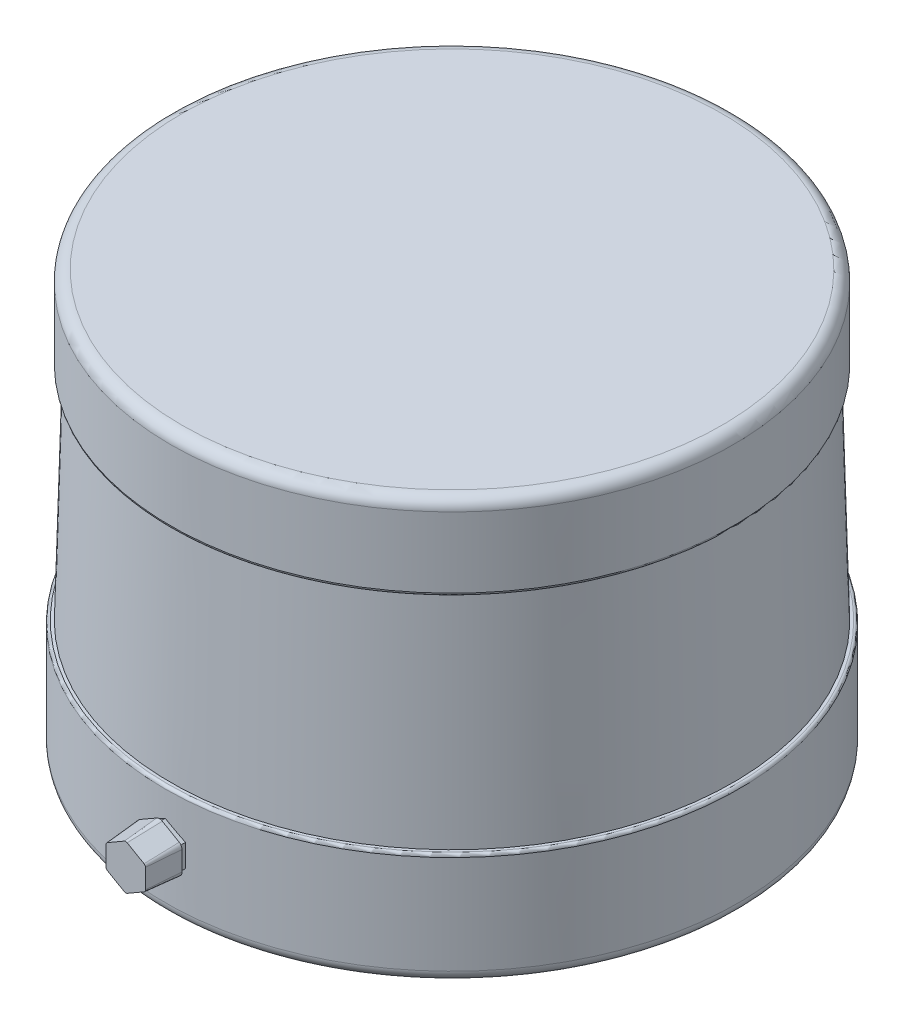
ISO-10303-21;
HEADER;
FILE_DESCRIPTION(('STEP AP214'),'2;1');
FILE_NAME('part.step','',(''),(''),'','','');
FILE_SCHEMA(('AUTOMOTIVE_DESIGN { 1 0 10303 214 1 1 1 1 }'));
ENDSEC;
DATA;
#1=APPLICATION_CONTEXT('core data for automotive mechanical design processes');
#2=APPLICATION_PROTOCOL_DEFINITION('international standard','automotive_design',2000,#1);
#3=PRODUCT_CONTEXT('',#1,'mechanical');
#4=PRODUCT('Part','Part','',(#3));
#5=PRODUCT_RELATED_PRODUCT_CATEGORY('part','',(#4));
#6=PRODUCT_DEFINITION_FORMATION('','',#4);
#7=PRODUCT_DEFINITION_CONTEXT('part definition',#1,'design');
#8=PRODUCT_DEFINITION('design','',#6,#7);
#9=PRODUCT_DEFINITION_SHAPE('','',#8);
#10=(LENGTH_UNIT() NAMED_UNIT(*) SI_UNIT(.MILLI.,.METRE.));
#11=(NAMED_UNIT(*) PLANE_ANGLE_UNIT() SI_UNIT($,.RADIAN.));
#12=(NAMED_UNIT(*) SI_UNIT($,.STERADIAN.) SOLID_ANGLE_UNIT());
#13=UNCERTAINTY_MEASURE_WITH_UNIT(LENGTH_MEASURE(1.E-05),#10,'distance_accuracy_value','');
#14=(GEOMETRIC_REPRESENTATION_CONTEXT(3) GLOBAL_UNCERTAINTY_ASSIGNED_CONTEXT((#13)) GLOBAL_UNIT_ASSIGNED_CONTEXT((#10,
#11,#12)) REPRESENTATION_CONTEXT('',''));
#15=CARTESIAN_POINT('',(0.,0.,0.));
#16=DIRECTION('',(0.,0.,1.));
#17=DIRECTION('',(1.,0.,0.));
#18=AXIS2_PLACEMENT_3D('',#15,#16,#17);
#19=CARTESIAN_POINT('',(0.,0.,0.));
#20=DIRECTION('',(0.,-1.,0.));
#21=DIRECTION('',(0.,0.,-1.));
#22=AXIS2_PLACEMENT_3D('',#19,#20,#21);
#23=CYLINDRICAL_SURFACE('',#22,51.);
#24=CARTESIAN_POINT('',(0.,19.5,0.));
#25=DIRECTION('',(0.,1.,0.));
#26=DIRECTION('',(0.,0.,1.));
#27=AXIS2_PLACEMENT_3D('',#24,#25,#26);
#28=CIRCLE('',#27,51.);
#29=CARTESIAN_POINT('',(0.,19.5,51.));
#30=VERTEX_POINT('',#29);
#31=EDGE_CURVE('E225',#30,#30,#28,.F.);
#32=ORIENTED_EDGE('',*,*,#31,.T.);
#33=EDGE_LOOP('',(#32));
#34=FACE_BOUND('',#33,.T.);
#35=CARTESIAN_POINT('',(0.,2.,0.));
#36=DIRECTION('',(0.,-1.,0.));
#37=DIRECTION('',(0.,0.,-1.));
#38=AXIS2_PLACEMENT_3D('',#35,#36,#37);
#39=CIRCLE('',#38,51.);
#40=CARTESIAN_POINT('',(0.,2.,-51.));
#41=VERTEX_POINT('',#40);
#42=EDGE_CURVE('E216',#41,#41,#39,.F.);
#43=ORIENTED_EDGE('',*,*,#42,.T.);
#44=EDGE_LOOP('',(#43));
#45=FACE_BOUND('',#44,.T.);
#46=CARTESIAN_POINT('',(0.,6.91709623134524,0.));
#47=DIRECTION('',(-0.5,0.866025403784439,0.));
#48=DIRECTION('',(-0.866025403784439,-0.5,0.));
#49=AXIS2_PLACEMENT_3D('',#46,#47,#48);
#50=ELLIPSE('',#49,58.8897274573418,51.);
#51=CARTESIAN_POINT('',(3.5,8.93782217350893,50.8797602195608));
#52=VERTEX_POINT('',#51);
#53=CARTESIAN_POINT('',(0.,6.91709623134524,51.));
#54=VERTEX_POINT('',#53);
#55=EDGE_CURVE('E247',#52,#54,#50,.F.);
#56=ORIENTED_EDGE('',*,*,#55,.T.);
#57=CARTESIAN_POINT('',(0.,6.91709623134524,0.));
#58=DIRECTION('',(0.5,0.866025403784438,0.));
#59=DIRECTION('',(0.866025403784438,-0.5,0.));
#60=AXIS2_PLACEMENT_3D('',#57,#58,#59);
#61=ELLIPSE('',#60,58.8897274573418,51.);
#62=CARTESIAN_POINT('',(-3.5,8.93782217350893,50.8797602195608));
#63=VERTEX_POINT('',#62);
#64=EDGE_CURVE('E250',#54,#63,#61,.F.);
#65=ORIENTED_EDGE('',*,*,#64,.T.);
#66=DIRECTION('',(0.,-1.,0.));
#67=VECTOR('',#66,1.);
#68=CARTESIAN_POINT('',(-3.50000000000001,0.,50.8797602195608));
#69=LINE('',#68,#67);
#70=CARTESIAN_POINT('',(-3.50000000000001,12.9792740578363,50.8797602195608));
#71=VERTEX_POINT('',#70);
#72=EDGE_CURVE('E184',#63,#71,#69,.F.);
#73=ORIENTED_EDGE('',*,*,#72,.T.);
#74=CARTESIAN_POINT('',(0.,15.,0.));
#75=DIRECTION('',(0.5,-0.866025403784439,0.));
#76=DIRECTION('',(-0.866025403784439,-0.5,0.));
#77=AXIS2_PLACEMENT_3D('',#74,#75,#76);
#78=ELLIPSE('',#77,58.8897274573418,51.);
#79=CARTESIAN_POINT('',(0.,15.,51.));
#80=VERTEX_POINT('',#79);
#81=EDGE_CURVE('E238',#71,#80,#78,.F.);
#82=ORIENTED_EDGE('',*,*,#81,.T.);
#83=CARTESIAN_POINT('',(0.,15.,0.));
#84=DIRECTION('',(-0.500000000000001,-0.866025403784438,0.));
#85=DIRECTION('',(0.866025403784438,-0.500000000000001,0.));
#86=AXIS2_PLACEMENT_3D('',#83,#84,#85);
#87=ELLIPSE('',#86,58.8897274573418,51.);
#88=CARTESIAN_POINT('',(3.5,12.9792740578363,50.8797602195608));
#89=VERTEX_POINT('',#88);
#90=EDGE_CURVE('E241',#80,#89,#87,.F.);
#91=ORIENTED_EDGE('',*,*,#90,.T.);
#92=DIRECTION('',(0.,-1.,0.));
#93=VECTOR('',#92,1.);
#94=CARTESIAN_POINT('',(3.49999999999999,0.,50.8797602195608));
#95=LINE('',#94,#93);
#96=EDGE_CURVE('E244',#89,#52,#95,.T.);
#97=ORIENTED_EDGE('',*,*,#96,.T.);
#98=EDGE_LOOP('',(#56,#65,#73,#82,#91,#97));
#99=FACE_BOUND('',#98,.T.);
#100=ADVANCED_FACE('F35',(#34,#45,#99),#23,.T.);
#101=CARTESIAN_POINT('',(0.,0.,0.));
#102=DIRECTION('',(0.,-1.,0.));
#103=DIRECTION('',(0.,0.,-1.));
#104=AXIS2_PLACEMENT_3D('',#101,#102,#103);
#105=PLANE('',#104);
#106=CARTESIAN_POINT('',(0.,0.,0.));
#107=DIRECTION('',(0.,-1.,0.));
#108=DIRECTION('',(0.,0.,-1.));
#109=AXIS2_PLACEMENT_3D('',#106,#107,#108);
#110=CIRCLE('',#109,49.);
#111=CARTESIAN_POINT('',(0.,0.,-49.));
#112=VERTEX_POINT('',#111);
#113=EDGE_CURVE('E213',#112,#112,#110,.T.);
#114=ORIENTED_EDGE('',*,*,#113,.T.);
#115=EDGE_LOOP('',(#114));
#116=FACE_BOUND('',#115,.T.);
#117=ADVANCED_FACE('F364',(#116),#105,.T.);
#118=CARTESIAN_POINT('',(51.,20.,0.));
#119=DIRECTION('',(0.,1.,0.));
#120=DIRECTION('',(0.,0.,1.));
#121=AXIS2_PLACEMENT_3D('',#118,#119,#120);
#122=PLANE('',#121);
#123=CARTESIAN_POINT('',(0.,20.,0.));
#124=DIRECTION('',(0.,1.,0.));
#125=DIRECTION('',(0.,0.,1.));
#126=AXIS2_PLACEMENT_3D('',#123,#124,#125);
#127=CIRCLE('',#126,50.5);
#128=CARTESIAN_POINT('',(0.,20.,50.5));
#129=VERTEX_POINT('',#128);
#130=EDGE_CURVE('E228',#129,#129,#127,.T.);
#131=ORIENTED_EDGE('',*,*,#130,.T.);
#132=EDGE_LOOP('',(#131));
#133=FACE_BOUND('',#132,.T.);
#134=CARTESIAN_POINT('',(0.,20.,0.));
#135=DIRECTION('',(0.,-1.,0.));
#136=DIRECTION('',(0.,0.,-1.));
#137=AXIS2_PLACEMENT_3D('',#134,#135,#136);
#138=CIRCLE('',#137,50.);
#139=CARTESIAN_POINT('',(0.,20.,-50.));
#140=VERTEX_POINT('',#139);
#141=EDGE_CURVE('E210',#140,#140,#138,.T.);
#142=ORIENTED_EDGE('',*,*,#141,.T.);
#143=EDGE_LOOP('',(#142));
#144=FACE_BOUND('',#143,.T.);
#145=ADVANCED_FACE('F370',(#133,#144),#122,.T.);
#146=CARTESIAN_POINT('',(0.,20.,0.));
#147=DIRECTION('',(0.,-1.,0.));
#148=DIRECTION('',(0.,0.,-1.));
#149=AXIS2_PLACEMENT_3D('',#146,#147,#148);
#150=CONICAL_SURFACE('',#149,50.,0.0256354085216773);
#151=CARTESIAN_POINT('',(0.,59.,0.));
#152=DIRECTION('',(0.,-1.,0.));
#153=DIRECTION('',(0.,0.,-1.));
#154=AXIS2_PLACEMENT_3D('',#151,#152,#153);
#155=CIRCLE('',#154,49.);
#156=CARTESIAN_POINT('',(0.,59.,-49.));
#157=VERTEX_POINT('',#156);
#158=EDGE_CURVE('E207',#157,#157,#155,.T.);
#159=ORIENTED_EDGE('',*,*,#158,.T.);
#160=EDGE_LOOP('',(#159));
#161=FACE_BOUND('',#160,.T.);
#162=ORIENTED_EDGE('',*,*,#141,.F.);
#163=EDGE_LOOP('',(#162));
#164=FACE_BOUND('',#163,.T.);
#165=ADVANCED_FACE('F594',(#161,#164),#150,.T.);
#166=CARTESIAN_POINT('',(49.,59.,0.));
#167=DIRECTION('',(0.,-1.,0.));
#168=DIRECTION('',(0.,0.,-1.));
#169=AXIS2_PLACEMENT_3D('',#166,#167,#168);
#170=PLANE('',#169);
#171=CARTESIAN_POINT('',(0.,59.,0.));
#172=DIRECTION('',(0.,-1.,0.));
#173=DIRECTION('',(0.,0.,-1.));
#174=AXIS2_PLACEMENT_3D('',#171,#172,#173);
#175=CIRCLE('',#174,49.5);
#176=CARTESIAN_POINT('',(0.,59.,-49.5));
#177=VERTEX_POINT('',#176);
#178=EDGE_CURVE('E231',#177,#177,#175,.T.);
#179=ORIENTED_EDGE('',*,*,#178,.T.);
#180=EDGE_LOOP('',(#179));
#181=FACE_BOUND('',#180,.T.);
#182=ORIENTED_EDGE('',*,*,#158,.F.);
#183=EDGE_LOOP('',(#182));
#184=FACE_BOUND('',#183,.T.);
#185=ADVANCED_FACE('F598',(#181,#184),#170,.T.);
#186=CARTESIAN_POINT('',(0.,0.,0.));
#187=DIRECTION('',(0.,-1.,0.));
#188=DIRECTION('',(0.,0.,-1.));
#189=AXIS2_PLACEMENT_3D('',#186,#187,#188);
#190=CYLINDRICAL_SURFACE('',#189,50.);
#191=CARTESIAN_POINT('',(0.,59.5,0.));
#192=DIRECTION('',(0.,-1.,0.));
#193=DIRECTION('',(0.,0.,-1.));
#194=AXIS2_PLACEMENT_3D('',#191,#192,#193);
#195=CIRCLE('',#194,50.);
#196=CARTESIAN_POINT('',(0.,59.5,-50.));
#197=VERTEX_POINT('',#196);
#198=EDGE_CURVE('E234',#197,#197,#195,.F.);
#199=ORIENTED_EDGE('',*,*,#198,.T.);
#200=EDGE_LOOP('',(#199));
#201=FACE_BOUND('',#200,.T.);
#202=CARTESIAN_POINT('',(0.,72.,0.));
#203=DIRECTION('',(0.,1.,0.));
#204=DIRECTION('',(0.,0.,1.));
#205=AXIS2_PLACEMENT_3D('',#202,#203,#204);
#206=CIRCLE('',#205,50.);
#207=CARTESIAN_POINT('',(0.,72.,50.));
#208=VERTEX_POINT('',#207);
#209=EDGE_CURVE('E219',#208,#208,#206,.F.);
#210=ORIENTED_EDGE('',*,*,#209,.T.);
#211=EDGE_LOOP('',(#210));
#212=FACE_BOUND('',#211,.T.);
#213=ADVANCED_FACE('F611',(#201,#212),#190,.T.);
#214=CARTESIAN_POINT('',(50.,74.,0.));
#215=DIRECTION('',(0.,1.,0.));
#216=DIRECTION('',(0.,0.,1.));
#217=AXIS2_PLACEMENT_3D('',#214,#215,#216);
#218=PLANE('',#217);
#219=CARTESIAN_POINT('',(0.,74.,0.));
#220=DIRECTION('',(0.,1.,0.));
#221=DIRECTION('',(0.,0.,1.));
#222=AXIS2_PLACEMENT_3D('',#219,#220,#221);
#223=CIRCLE('',#222,48.);
#224=CARTESIAN_POINT('',(0.,74.,48.));
#225=VERTEX_POINT('',#224);
#226=EDGE_CURVE('E222',#225,#225,#223,.T.);
#227=ORIENTED_EDGE('',*,*,#226,.T.);
#228=EDGE_LOOP('',(#227));
#229=FACE_BOUND('',#228,.T.);
#230=ADVANCED_FACE('F381',(#229),#218,.T.);
#231=CARTESIAN_POINT('',(0.,2.,0.));
#232=DIRECTION('',(0.,-1.,0.));
#233=DIRECTION('',(0.,0.,-1.));
#234=AXIS2_PLACEMENT_3D('',#231,#232,#233);
#235=TOROIDAL_SURFACE('',#234,49.,2.);
#236=ORIENTED_EDGE('',*,*,#42,.F.);
#237=EDGE_LOOP('',(#236));
#238=FACE_BOUND('',#237,.T.);
#239=ORIENTED_EDGE('',*,*,#113,.F.);
#240=EDGE_LOOP('',(#239));
#241=FACE_BOUND('',#240,.T.);
#242=ADVANCED_FACE('F377',(#238,#241),#235,.T.);
#243=CARTESIAN_POINT('',(0.,72.,0.));
#244=DIRECTION('',(0.,1.,0.));
#245=DIRECTION('',(0.,0.,1.));
#246=AXIS2_PLACEMENT_3D('',#243,#244,#245);
#247=TOROIDAL_SURFACE('',#246,48.,2.);
#248=ORIENTED_EDGE('',*,*,#226,.F.);
#249=EDGE_LOOP('',(#248));
#250=FACE_BOUND('',#249,.T.);
#251=ORIENTED_EDGE('',*,*,#209,.F.);
#252=EDGE_LOOP('',(#251));
#253=FACE_BOUND('',#252,.T.);
#254=ADVANCED_FACE('F380',(#250,#253),#247,.T.);
#255=CARTESIAN_POINT('',(0.,19.5,0.));
#256=DIRECTION('',(0.,1.,0.));
#257=DIRECTION('',(0.,0.,1.));
#258=AXIS2_PLACEMENT_3D('',#255,#256,#257);
#259=TOROIDAL_SURFACE('',#258,50.5,0.5);
#260=ORIENTED_EDGE('',*,*,#130,.F.);
#261=EDGE_LOOP('',(#260));
#262=FACE_BOUND('',#261,.T.);
#263=ORIENTED_EDGE('',*,*,#31,.F.);
#264=EDGE_LOOP('',(#263));
#265=FACE_BOUND('',#264,.T.);
#266=ADVANCED_FACE('F385',(#262,#265),#259,.T.);
#267=CARTESIAN_POINT('',(0.,59.5,0.));
#268=DIRECTION('',(0.,-1.,0.));
#269=DIRECTION('',(0.,0.,-1.));
#270=AXIS2_PLACEMENT_3D('',#267,#268,#269);
#271=TOROIDAL_SURFACE('',#270,49.5,0.5);
#272=ORIENTED_EDGE('',*,*,#198,.F.);
#273=EDGE_LOOP('',(#272));
#274=FACE_BOUND('',#273,.T.);
#275=ORIENTED_EDGE('',*,*,#178,.F.);
#276=EDGE_LOOP('',(#275));
#277=FACE_BOUND('',#276,.T.);
#278=ADVANCED_FACE('F389',(#274,#277),#271,.T.);
#279=CARTESIAN_POINT('',(-3.5,8.93782217350893,52.));
#280=DIRECTION('',(0.5,0.866025403784438,0.));
#281=DIRECTION('',(-0.866025403784438,0.5,0.));
#282=AXIS2_PLACEMENT_3D('',#279,#280,#281);
#283=PLANE('',#282);
#284=ORIENTED_EDGE('',*,*,#64,.F.);
#285=DIRECTION('',(0.,0.,-1.));
#286=VECTOR('',#285,1.);
#287=CARTESIAN_POINT('',(0.,6.91709623134524,52.));
#288=LINE('',#287,#286);
#289=CARTESIAN_POINT('',(0.,6.91709623134524,52.));
#290=VERTEX_POINT('',#289);
#291=EDGE_CURVE('E171',#290,#54,#288,.T.);
#292=ORIENTED_EDGE('',*,*,#291,.F.);
#293=DIRECTION('',(0.866025403784438,-0.500000000000001,0.));
#294=VECTOR('',#293,1.);
#295=CARTESIAN_POINT('',(-3.5,8.93782217350893,52.));
#296=LINE('',#295,#294);
#297=CARTESIAN_POINT('',(-3.5,8.93782217350893,52.));
#298=VERTEX_POINT('',#297);
#299=EDGE_CURVE('E165',#298,#290,#296,.T.);
#300=ORIENTED_EDGE('',*,*,#299,.F.);
#301=DIRECTION('',(0.,0.,-1.));
#302=VECTOR('',#301,1.);
#303=CARTESIAN_POINT('',(-3.5,8.93782217350893,52.));
#304=LINE('',#303,#302);
#305=EDGE_CURVE('E168',#298,#63,#304,.T.);
#306=ORIENTED_EDGE('',*,*,#305,.T.);
#307=EDGE_LOOP('',(#284,#292,#300,#306));
#308=FACE_BOUND('',#307,.T.);
#309=ADVANCED_FACE('F167',(#308),#283,.F.);
#310=CARTESIAN_POINT('',(0.,6.91709623134524,52.));
#311=DIRECTION('',(-0.5,0.866025403784439,0.));
#312=DIRECTION('',(-0.866025403784439,-0.5,0.));
#313=AXIS2_PLACEMENT_3D('',#310,#311,#312);
#314=PLANE('',#313);
#315=ORIENTED_EDGE('',*,*,#55,.F.);
#316=DIRECTION('',(0.,0.,-1.));
#317=VECTOR('',#316,1.);
#318=CARTESIAN_POINT('',(3.5,8.93782217350893,52.));
#319=LINE('',#318,#317);
#320=CARTESIAN_POINT('',(3.5,8.93782217350893,52.));
#321=VERTEX_POINT('',#320);
#322=EDGE_CURVE('E203',#321,#52,#319,.T.);
#323=ORIENTED_EDGE('',*,*,#322,.F.);
#324=DIRECTION('',(0.866025403784439,0.5,0.));
#325=VECTOR('',#324,1.);
#326=CARTESIAN_POINT('',(0.,6.91709623134524,52.));
#327=LINE('',#326,#325);
#328=EDGE_CURVE('E175',#290,#321,#327,.T.);
#329=ORIENTED_EDGE('',*,*,#328,.F.);
#330=ORIENTED_EDGE('',*,*,#291,.T.);
#331=EDGE_LOOP('',(#315,#323,#329,#330));
#332=FACE_BOUND('',#331,.T.);
#333=ADVANCED_FACE('F352',(#332),#314,.F.);
#334=CARTESIAN_POINT('',(3.5,8.93782217350893,52.));
#335=DIRECTION('',(-1.,0.,0.));
#336=DIRECTION('',(0.,-1.,0.));
#337=AXIS2_PLACEMENT_3D('',#334,#335,#336);
#338=PLANE('',#337);
#339=ORIENTED_EDGE('',*,*,#96,.F.);
#340=DIRECTION('',(0.,0.,-1.));
#341=VECTOR('',#340,1.);
#342=CARTESIAN_POINT('',(3.5,12.9792740578363,52.));
#343=LINE('',#342,#341);
#344=CARTESIAN_POINT('',(3.5,12.9792740578363,52.));
#345=VERTEX_POINT('',#344);
#346=EDGE_CURVE('E200',#345,#89,#343,.T.);
#347=ORIENTED_EDGE('',*,*,#346,.F.);
#348=DIRECTION('',(0.,1.,0.));
#349=VECTOR('',#348,1.);
#350=CARTESIAN_POINT('',(3.5,8.93782217350893,52.));
#351=LINE('',#350,#349);
#352=EDGE_CURVE('E341',#321,#345,#351,.T.);
#353=ORIENTED_EDGE('',*,*,#352,.F.);
#354=ORIENTED_EDGE('',*,*,#322,.T.);
#355=EDGE_LOOP('',(#339,#347,#353,#354));
#356=FACE_BOUND('',#355,.T.);
#357=ADVANCED_FACE('F354',(#356),#338,.F.);
#358=CARTESIAN_POINT('',(3.5,12.9792740578363,52.));
#359=DIRECTION('',(-0.500000000000001,-0.866025403784438,0.));
#360=DIRECTION('',(0.866025403784438,-0.500000000000001,0.));
#361=AXIS2_PLACEMENT_3D('',#358,#359,#360);
#362=PLANE('',#361);
#363=ORIENTED_EDGE('',*,*,#90,.F.);
#364=DIRECTION('',(0.,0.,-1.));
#365=VECTOR('',#364,1.);
#366=CARTESIAN_POINT('',(0.,15.,52.));
#367=LINE('',#366,#365);
#368=CARTESIAN_POINT('',(0.,15.,52.));
#369=VERTEX_POINT('',#368);
#370=EDGE_CURVE('E197',#369,#80,#367,.T.);
#371=ORIENTED_EDGE('',*,*,#370,.F.);
#372=DIRECTION('',(-0.866025403784438,0.500000000000001,0.));
#373=VECTOR('',#372,1.);
#374=CARTESIAN_POINT('',(3.5,12.9792740578363,52.));
#375=LINE('',#374,#373);
#376=EDGE_CURVE('E192',#345,#369,#375,.T.);
#377=ORIENTED_EDGE('',*,*,#376,.F.);
#378=ORIENTED_EDGE('',*,*,#346,.T.);
#379=EDGE_LOOP('',(#363,#371,#377,#378));
#380=FACE_BOUND('',#379,.T.);
#381=ADVANCED_FACE('F346',(#380),#362,.F.);
#382=CARTESIAN_POINT('',(0.,15.,52.));
#383=DIRECTION('',(0.5,-0.866025403784439,0.));
#384=DIRECTION('',(0.866025403784439,0.5,0.));
#385=AXIS2_PLACEMENT_3D('',#382,#383,#384);
#386=PLANE('',#385);
#387=ORIENTED_EDGE('',*,*,#81,.F.);
#388=DIRECTION('',(0.,0.,-1.));
#389=VECTOR('',#388,1.);
#390=CARTESIAN_POINT('',(-3.5,12.9792740578363,52.));
#391=LINE('',#390,#389);
#392=CARTESIAN_POINT('',(-3.5,12.9792740578363,52.));
#393=VERTEX_POINT('',#392);
#394=EDGE_CURVE('E185',#393,#71,#391,.T.);
#395=ORIENTED_EDGE('',*,*,#394,.F.);
#396=DIRECTION('',(-0.866025403784439,-0.5,0.));
#397=VECTOR('',#396,1.);
#398=CARTESIAN_POINT('',(0.,15.,52.));
#399=LINE('',#398,#397);
#400=EDGE_CURVE('E190',#369,#393,#399,.T.);
#401=ORIENTED_EDGE('',*,*,#400,.F.);
#402=ORIENTED_EDGE('',*,*,#370,.T.);
#403=EDGE_LOOP('',(#387,#395,#401,#402));
#404=FACE_BOUND('',#403,.T.);
#405=ADVANCED_FACE('F349',(#404),#386,.F.);
#406=CARTESIAN_POINT('',(-3.5,12.9792740578363,52.));
#407=DIRECTION('',(1.,0.,0.));
#408=DIRECTION('',(0.,1.,0.));
#409=AXIS2_PLACEMENT_3D('',#406,#407,#408);
#410=PLANE('',#409);
#411=ORIENTED_EDGE('',*,*,#72,.F.);
#412=ORIENTED_EDGE('',*,*,#305,.F.);
#413=DIRECTION('',(0.,-1.,0.));
#414=VECTOR('',#413,1.);
#415=CARTESIAN_POINT('',(-3.5,12.9792740578363,52.));
#416=LINE('',#415,#414);
#417=EDGE_CURVE('E181',#393,#298,#416,.T.);
#418=ORIENTED_EDGE('',*,*,#417,.F.);
#419=ORIENTED_EDGE('',*,*,#394,.T.);
#420=EDGE_LOOP('',(#411,#412,#418,#419));
#421=FACE_BOUND('',#420,.T.);
#422=ADVANCED_FACE('F180',(#421),#410,.F.);
#423=CARTESIAN_POINT('',(0.,0.,52.));
#424=DIRECTION('',(0.,0.,1.));
#425=DIRECTION('',(1.,0.,0.));
#426=AXIS2_PLACEMENT_3D('',#423,#424,#425);
#427=PLANE('',#426);
#428=DIRECTION('',(0.866025403784439,0.5,0.));
#429=VECTOR('',#428,1.);
#430=CARTESIAN_POINT('',(0.,6.33974596215561,52.));
#431=LINE('',#430,#429);
#432=CARTESIAN_POINT('',(0.500000000000001,6.62842109675043,52.));
#433=VERTEX_POINT('',#432);
#434=CARTESIAN_POINT('',(3.5,8.3604719043193,52.));
#435=VERTEX_POINT('',#434);
#436=EDGE_CURVE('E327',#433,#435,#431,.T.);
#437=ORIENTED_EDGE('',*,*,#436,.F.);
#438=CARTESIAN_POINT('',(0.,7.49444650053487,52.));
#439=DIRECTION('',(0.,0.,1.));
#440=DIRECTION('',(1.,0.,0.));
#441=AXIS2_PLACEMENT_3D('',#438,#439,#440);
#442=CIRCLE('',#441,1.);
#443=CARTESIAN_POINT('',(-0.499999999999999,6.62842109675043,52.));
#444=VERTEX_POINT('',#443);
#445=EDGE_CURVE('E262',#433,#444,#442,.F.);
#446=ORIENTED_EDGE('',*,*,#445,.T.);
#447=DIRECTION('',(0.866025403784439,-0.5,0.));
#448=VECTOR('',#447,1.);
#449=CARTESIAN_POINT('',(-4.,8.64914703891412,52.));
#450=LINE('',#449,#448);
#451=CARTESIAN_POINT('',(-3.5,8.3604719043193,52.));
#452=VERTEX_POINT('',#451);
#453=EDGE_CURVE('E323',#452,#444,#450,.T.);
#454=ORIENTED_EDGE('',*,*,#453,.F.);
#455=CARTESIAN_POINT('',(-3.,9.22649730810374,52.));
#456=DIRECTION('',(0.,0.,1.));
#457=DIRECTION('',(1.,0.,0.));
#458=AXIS2_PLACEMENT_3D('',#455,#456,#457);
#459=CIRCLE('',#458,1.);
#460=CARTESIAN_POINT('',(-4.,9.22649730810374,52.));
#461=VERTEX_POINT('',#460);
#462=EDGE_CURVE('E260',#452,#461,#459,.F.);
#463=ORIENTED_EDGE('',*,*,#462,.T.);
#464=DIRECTION('',(0.,-1.,0.));
#465=VECTOR('',#464,1.);
#466=CARTESIAN_POINT('',(-4.,13.2679491924311,52.));
#467=LINE('',#466,#465);
#468=CARTESIAN_POINT('',(-4.,12.6905989232415,52.));
#469=VERTEX_POINT('',#468);
#470=EDGE_CURVE('E317',#469,#461,#467,.T.);
#471=ORIENTED_EDGE('',*,*,#470,.F.);
#472=CARTESIAN_POINT('',(-3.,12.6905989232415,52.));
#473=DIRECTION('',(0.,0.,1.));
#474=DIRECTION('',(1.,0.,0.));
#475=AXIS2_PLACEMENT_3D('',#472,#473,#474);
#476=CIRCLE('',#475,1.);
#477=CARTESIAN_POINT('',(-3.5,13.5566243270259,52.));
#478=VERTEX_POINT('',#477);
#479=EDGE_CURVE('E258',#469,#478,#476,.F.);
#480=ORIENTED_EDGE('',*,*,#479,.T.);
#481=DIRECTION('',(-0.866025403784438,-0.5,0.));
#482=VECTOR('',#481,1.);
#483=CARTESIAN_POINT('',(0.,15.5773502691896,52.));
#484=LINE('',#483,#482);
#485=CARTESIAN_POINT('',(-0.500000000000002,15.2886751345948,52.));
#486=VERTEX_POINT('',#485);
#487=EDGE_CURVE('E176',#486,#478,#484,.T.);
#488=ORIENTED_EDGE('',*,*,#487,.F.);
#489=CARTESIAN_POINT('',(0.,14.4226497308104,52.));
#490=DIRECTION('',(0.,0.,1.));
#491=DIRECTION('',(1.,0.,0.));
#492=AXIS2_PLACEMENT_3D('',#489,#490,#491);
#493=CIRCLE('',#492,1.);
#494=CARTESIAN_POINT('',(0.499999999999999,15.2886751345948,52.));
#495=VERTEX_POINT('',#494);
#496=EDGE_CURVE('E256',#486,#495,#493,.F.);
#497=ORIENTED_EDGE('',*,*,#496,.T.);
#498=DIRECTION('',(-0.866025403784439,0.5,0.));
#499=VECTOR('',#498,1.);
#500=CARTESIAN_POINT('',(4.,13.2679491924311,52.));
#501=LINE('',#500,#499);
#502=CARTESIAN_POINT('',(3.5,13.5566243270259,52.));
#503=VERTEX_POINT('',#502);
#504=EDGE_CURVE('E335',#503,#495,#501,.T.);
#505=ORIENTED_EDGE('',*,*,#504,.F.);
#506=CARTESIAN_POINT('',(3.,12.6905989232415,52.));
#507=DIRECTION('',(0.,0.,1.));
#508=DIRECTION('',(1.,0.,0.));
#509=AXIS2_PLACEMENT_3D('',#506,#507,#508);
#510=CIRCLE('',#509,1.);
#511=CARTESIAN_POINT('',(4.,12.6905989232415,52.));
#512=VERTEX_POINT('',#511);
#513=EDGE_CURVE('E252',#503,#512,#510,.F.);
#514=ORIENTED_EDGE('',*,*,#513,.T.);
#515=DIRECTION('',(0.,1.,0.));
#516=VECTOR('',#515,1.);
#517=CARTESIAN_POINT('',(4.,8.64914703891412,52.));
#518=LINE('',#517,#516);
#519=CARTESIAN_POINT('',(4.,9.22649730810374,52.));
#520=VERTEX_POINT('',#519);
#521=EDGE_CURVE('E332',#520,#512,#518,.T.);
#522=ORIENTED_EDGE('',*,*,#521,.F.);
#523=CARTESIAN_POINT('',(3.,9.22649730810374,52.));
#524=DIRECTION('',(0.,0.,1.));
#525=DIRECTION('',(1.,0.,0.));
#526=AXIS2_PLACEMENT_3D('',#523,#524,#525);
#527=CIRCLE('',#526,1.);
#528=EDGE_CURVE('E254',#520,#435,#527,.F.);
#529=ORIENTED_EDGE('',*,*,#528,.T.);
#530=EDGE_LOOP('',(#437,#446,#454,#463,#471,#480,#488,#497,#505,#514,#522,#529));
#531=FACE_BOUND('',#530,.T.);
#532=ORIENTED_EDGE('',*,*,#417,.T.);
#533=ORIENTED_EDGE('',*,*,#299,.T.);
#534=ORIENTED_EDGE('',*,*,#328,.T.);
#535=ORIENTED_EDGE('',*,*,#352,.T.);
#536=ORIENTED_EDGE('',*,*,#376,.T.);
#537=ORIENTED_EDGE('',*,*,#400,.T.);
#538=EDGE_LOOP('',(#532,#533,#534,#535,#536,#537));
#539=FACE_BOUND('',#538,.T.);
#540=ADVANCED_FACE('F187',(#531,#539),#427,.F.);
#541=CARTESIAN_POINT('',(0.,0.,58.));
#542=DIRECTION('',(0.,0.,1.));
#543=DIRECTION('',(1.,0.,0.));
#544=AXIS2_PLACEMENT_3D('',#541,#542,#543);
#545=PLANE('',#544);
#546=CARTESIAN_POINT('',(-3.,9.22649730810374,58.));
#547=DIRECTION('',(0.,0.,1.));
#548=DIRECTION('',(1.,0.,0.));
#549=AXIS2_PLACEMENT_3D('',#546,#547,#548);
#550=CIRCLE('',#549,0.499999999999998);
#551=CARTESIAN_POINT('',(-3.5,9.22649730810374,58.));
#552=VERTEX_POINT('',#551);
#553=CARTESIAN_POINT('',(-3.25,8.79348460621153,58.));
#554=VERTEX_POINT('',#553);
#555=EDGE_CURVE('E59',#552,#554,#550,.T.);
#556=ORIENTED_EDGE('',*,*,#555,.T.);
#557=DIRECTION('',(0.866025403784439,-0.5,0.));
#558=VECTOR('',#557,1.);
#559=CARTESIAN_POINT('',(-0.249999999999998,7.06143379864265,58.));
#560=LINE('',#559,#558);
#561=CARTESIAN_POINT('',(-0.249999999999999,7.06143379864265,58.));
#562=VERTEX_POINT('',#561);
#563=EDGE_CURVE('E11',#554,#562,#560,.T.);
#564=ORIENTED_EDGE('',*,*,#563,.T.);
#565=CARTESIAN_POINT('',(0.,7.49444650053487,58.));
#566=DIRECTION('',(0.,0.,1.));
#567=DIRECTION('',(1.,0.,0.));
#568=AXIS2_PLACEMENT_3D('',#565,#566,#567);
#569=CIRCLE('',#568,0.499999999999998);
#570=CARTESIAN_POINT('',(0.25,7.06143379864265,58.));
#571=VERTEX_POINT('',#570);
#572=EDGE_CURVE('E44',#562,#571,#569,.T.);
#573=ORIENTED_EDGE('',*,*,#572,.T.);
#574=DIRECTION('',(0.866025403784439,0.5,0.));
#575=VECTOR('',#574,1.);
#576=CARTESIAN_POINT('',(3.25,8.79348460621152,58.));
#577=LINE('',#576,#575);
#578=CARTESIAN_POINT('',(3.25,8.79348460621153,58.));
#579=VERTEX_POINT('',#578);
#580=EDGE_CURVE('E280',#571,#579,#577,.T.);
#581=ORIENTED_EDGE('',*,*,#580,.T.);
#582=CARTESIAN_POINT('',(3.,9.22649730810374,58.));
#583=DIRECTION('',(0.,0.,1.));
#584=DIRECTION('',(1.,0.,0.));
#585=AXIS2_PLACEMENT_3D('',#582,#583,#584);
#586=CIRCLE('',#585,0.499999999999997);
#587=CARTESIAN_POINT('',(3.5,9.22649730810374,58.));
#588=VERTEX_POINT('',#587);
#589=EDGE_CURVE('E276',#579,#588,#586,.T.);
#590=ORIENTED_EDGE('',*,*,#589,.T.);
#591=DIRECTION('',(0.,1.,0.));
#592=VECTOR('',#591,1.);
#593=CARTESIAN_POINT('',(3.5,12.6905989232415,58.));
#594=LINE('',#593,#592);
#595=CARTESIAN_POINT('',(3.5,12.6905989232415,58.));
#596=VERTEX_POINT('',#595);
#597=EDGE_CURVE('E272',#588,#596,#594,.T.);
#598=ORIENTED_EDGE('',*,*,#597,.T.);
#599=CARTESIAN_POINT('',(3.,12.6905989232415,58.));
#600=DIRECTION('',(0.,0.,1.));
#601=DIRECTION('',(1.,0.,0.));
#602=AXIS2_PLACEMENT_3D('',#599,#600,#601);
#603=CIRCLE('',#602,0.499999999999998);
#604=CARTESIAN_POINT('',(3.25,13.1236116251337,58.));
#605=VERTEX_POINT('',#604);
#606=EDGE_CURVE('E268',#596,#605,#603,.T.);
#607=ORIENTED_EDGE('',*,*,#606,.T.);
#608=DIRECTION('',(-0.866025403784439,0.5,0.));
#609=VECTOR('',#608,1.);
#610=CARTESIAN_POINT('',(0.249999999999997,14.8556624327026,58.));
#611=LINE('',#610,#609);
#612=CARTESIAN_POINT('',(0.249999999999997,14.8556624327026,58.));
#613=VERTEX_POINT('',#612);
#614=EDGE_CURVE('E264',#605,#613,#611,.T.);
#615=ORIENTED_EDGE('',*,*,#614,.T.);
#616=CARTESIAN_POINT('',(0.,14.4226497308104,58.));
#617=DIRECTION('',(0.,0.,1.));
#618=DIRECTION('',(1.,0.,0.));
#619=AXIS2_PLACEMENT_3D('',#616,#617,#618);
#620=CIRCLE('',#619,0.499999999999998);
#621=CARTESIAN_POINT('',(-0.25,14.8556624327026,58.));
#622=VERTEX_POINT('',#621);
#623=EDGE_CURVE('E266',#613,#622,#620,.T.);
#624=ORIENTED_EDGE('',*,*,#623,.T.);
#625=DIRECTION('',(-0.866025403784439,-0.5,0.));
#626=VECTOR('',#625,1.);
#627=CARTESIAN_POINT('',(-3.25,13.1236116251337,58.));
#628=LINE('',#627,#626);
#629=CARTESIAN_POINT('',(-3.25,13.1236116251337,58.));
#630=VERTEX_POINT('',#629);
#631=EDGE_CURVE('E270',#622,#630,#628,.T.);
#632=ORIENTED_EDGE('',*,*,#631,.T.);
#633=CARTESIAN_POINT('',(-3.,12.6905989232415,58.));
#634=DIRECTION('',(0.,0.,1.));
#635=DIRECTION('',(1.,0.,0.));
#636=AXIS2_PLACEMENT_3D('',#633,#634,#635);
#637=CIRCLE('',#636,0.499999999999998);
#638=CARTESIAN_POINT('',(-3.5,12.6905989232415,58.));
#639=VERTEX_POINT('',#638);
#640=EDGE_CURVE('E274',#630,#639,#637,.T.);
#641=ORIENTED_EDGE('',*,*,#640,.T.);
#642=DIRECTION('',(0.,-1.,0.));
#643=VECTOR('',#642,1.);
#644=CARTESIAN_POINT('',(-3.5,9.22649730810374,58.));
#645=LINE('',#644,#643);
#646=EDGE_CURVE('E278',#639,#552,#645,.T.);
#647=ORIENTED_EDGE('',*,*,#646,.T.);
#648=EDGE_LOOP('',(#556,#564,#573,#581,#590,#598,#607,#615,#624,#632,#641,#647));
#649=FACE_BOUND('',#648,.T.);
#650=ADVANCED_FACE('F435',(#649),#545,.T.);
#651=CARTESIAN_POINT('',(6.49519052838329,11.25,58.));
#652=DIRECTION('',(0.49827287912244,0.863033942673692,0.0830454798537368));
#653=DIRECTION('',(0.866025403784439,-0.5,0.));
#654=AXIS2_PLACEMENT_3D('',#651,#652,#653);
#655=PLANE('',#654);
#656=DIRECTION('',(-0.0415227399268683,-0.0719194952228048,0.99654575824488));
#657=VECTOR('',#656,1.);
#658=CARTESIAN_POINT('',(3.5,13.5566243270259,51.9999999999997));
#659=LINE('',#658,#657);
#660=EDGE_CURVE('E310',#503,#605,#659,.T.);
#661=ORIENTED_EDGE('',*,*,#660,.F.);
#662=ORIENTED_EDGE('',*,*,#504,.T.);
#663=DIRECTION('',(0.0415227399268683,0.0719194952228048,-0.99654575824488));
#664=VECTOR('',#663,1.);
#665=CARTESIAN_POINT('',(0.249999999999997,14.8556624327026,58.));
#666=LINE('',#665,#664);
#667=EDGE_CURVE('E39',#613,#495,#666,.T.);
#668=ORIENTED_EDGE('',*,*,#667,.F.);
#669=ORIENTED_EDGE('',*,*,#614,.F.);
#670=EDGE_LOOP('',(#661,#662,#668,#669));
#671=FACE_BOUND('',#670,.T.);
#672=ADVANCED_FACE('F37',(#671),#655,.T.);
#673=CARTESIAN_POINT('',(0.,14.4226497308104,58.));
#674=DIRECTION('',(0.,0.,-1.));
#675=DIRECTION('',(-1.,0.,0.));
#676=AXIS2_PLACEMENT_3D('',#673,#674,#675);
#677=CONICAL_SURFACE('',#676,0.499999999999998,0.0831412318884376);
#678=ORIENTED_EDGE('',*,*,#667,.T.);
#679=ORIENTED_EDGE('',*,*,#496,.F.);
#680=DIRECTION('',(-0.0415227399268682,0.0719194952228046,-0.99654575824488));
#681=VECTOR('',#680,1.);
#682=CARTESIAN_POINT('',(-0.25,14.8556624327026,58.));
#683=LINE('',#682,#681);
#684=EDGE_CURVE('E308',#622,#486,#683,.T.);
#685=ORIENTED_EDGE('',*,*,#684,.F.);
#686=ORIENTED_EDGE('',*,*,#623,.F.);
#687=EDGE_LOOP('',(#678,#679,#685,#686));
#688=FACE_BOUND('',#687,.T.);
#689=ADVANCED_FACE('F430',(#688),#677,.T.);
#690=CARTESIAN_POINT('',(3.,12.6905989232415,58.));
#691=DIRECTION('',(0.,0.,-1.));
#692=DIRECTION('',(-1.,0.,0.));
#693=AXIS2_PLACEMENT_3D('',#690,#691,#692);
#694=CONICAL_SURFACE('',#693,0.499999999999998,0.0831412318884377);
#695=ORIENTED_EDGE('',*,*,#660,.T.);
#696=ORIENTED_EDGE('',*,*,#606,.F.);
#697=DIRECTION('',(-0.0830454798537364,0.,0.99654575824488));
#698=VECTOR('',#697,1.);
#699=CARTESIAN_POINT('',(4.,12.6905989232415,51.9999999999997));
#700=LINE('',#699,#698);
#701=EDGE_CURVE('E305',#512,#596,#700,.T.);
#702=ORIENTED_EDGE('',*,*,#701,.F.);
#703=ORIENTED_EDGE('',*,*,#513,.F.);
#704=EDGE_LOOP('',(#695,#696,#702,#703));
#705=FACE_BOUND('',#704,.T.);
#706=ADVANCED_FACE('F427',(#705),#694,.T.);
#707=CARTESIAN_POINT('',(-6.49519052838329,11.25,58.));
#708=DIRECTION('',(-0.49827287912244,0.863033942673691,0.0830454798537363));
#709=DIRECTION('',(0.866025403784439,0.5,0.));
#710=AXIS2_PLACEMENT_3D('',#707,#708,#709);
#711=PLANE('',#710);
#712=ORIENTED_EDGE('',*,*,#684,.T.);
#713=ORIENTED_EDGE('',*,*,#487,.T.);
#714=DIRECTION('',(-0.0415227399268681,0.0719194952228044,-0.99654575824488));
#715=VECTOR('',#714,1.);
#716=CARTESIAN_POINT('',(-3.25,13.1236116251337,58.));
#717=LINE('',#716,#715);
#718=EDGE_CURVE('E302',#630,#478,#717,.T.);
#719=ORIENTED_EDGE('',*,*,#718,.F.);
#720=ORIENTED_EDGE('',*,*,#631,.F.);
#721=EDGE_LOOP('',(#712,#713,#719,#720));
#722=FACE_BOUND('',#721,.T.);
#723=ADVANCED_FACE('F423',(#722),#711,.T.);
#724=CARTESIAN_POINT('',(3.5,0.,58.));
#725=DIRECTION('',(0.99654575824488,0.,0.0830454798537364));
#726=DIRECTION('',(0.,-1.,0.));
#727=AXIS2_PLACEMENT_3D('',#724,#725,#726);
#728=PLANE('',#727);
#729=ORIENTED_EDGE('',*,*,#701,.T.);
#730=ORIENTED_EDGE('',*,*,#597,.F.);
#731=DIRECTION('',(-0.0830454798537364,0.,0.99654575824488));
#732=VECTOR('',#731,1.);
#733=CARTESIAN_POINT('',(4.,9.22649730810374,51.9999999999997));
#734=LINE('',#733,#732);
#735=EDGE_CURVE('E299',#520,#588,#734,.T.);
#736=ORIENTED_EDGE('',*,*,#735,.F.);
#737=ORIENTED_EDGE('',*,*,#521,.T.);
#738=EDGE_LOOP('',(#729,#730,#736,#737));
#739=FACE_BOUND('',#738,.T.);
#740=ADVANCED_FACE('F419',(#739),#728,.T.);
#741=CARTESIAN_POINT('',(-3.,12.6905989232415,58.));
#742=DIRECTION('',(0.,0.,-1.));
#743=DIRECTION('',(-1.,0.,0.));
#744=AXIS2_PLACEMENT_3D('',#741,#742,#743);
#745=CONICAL_SURFACE('',#744,0.499999999999998,0.0831412318884376);
#746=ORIENTED_EDGE('',*,*,#718,.T.);
#747=ORIENTED_EDGE('',*,*,#479,.F.);
#748=DIRECTION('',(-0.0830454798537364,0.,-0.99654575824488));
#749=VECTOR('',#748,1.);
#750=CARTESIAN_POINT('',(-3.5,12.6905989232415,58.));
#751=LINE('',#750,#749);
#752=EDGE_CURVE('E296',#639,#469,#751,.T.);
#753=ORIENTED_EDGE('',*,*,#752,.F.);
#754=ORIENTED_EDGE('',*,*,#640,.F.);
#755=EDGE_LOOP('',(#746,#747,#753,#754));
#756=FACE_BOUND('',#755,.T.);
#757=ADVANCED_FACE('F415',(#756),#745,.T.);
#758=CARTESIAN_POINT('',(3.,9.22649730810374,58.));
#759=DIRECTION('',(0.,0.,-1.));
#760=DIRECTION('',(-1.,0.,0.));
#761=AXIS2_PLACEMENT_3D('',#758,#759,#760);
#762=CONICAL_SURFACE('',#761,0.499999999999997,0.0831412318884378);
#763=ORIENTED_EDGE('',*,*,#735,.T.);
#764=ORIENTED_EDGE('',*,*,#589,.F.);
#765=DIRECTION('',(-0.0415227399268682,0.0719194952228049,0.99654575824488));
#766=VECTOR('',#765,1.);
#767=CARTESIAN_POINT('',(3.5,8.3604719043193,51.9999999999997));
#768=LINE('',#767,#766);
#769=EDGE_CURVE('E293',#435,#579,#768,.T.);
#770=ORIENTED_EDGE('',*,*,#769,.F.);
#771=ORIENTED_EDGE('',*,*,#528,.F.);
#772=EDGE_LOOP('',(#763,#764,#770,#771));
#773=FACE_BOUND('',#772,.T.);
#774=ADVANCED_FACE('F412',(#773),#762,.T.);
#775=CARTESIAN_POINT('',(-3.5,0.,58.));
#776=DIRECTION('',(-0.99654575824488,0.,0.0830454798537364));
#777=DIRECTION('',(0.,1.,0.));
#778=AXIS2_PLACEMENT_3D('',#775,#776,#777);
#779=PLANE('',#778);
#780=ORIENTED_EDGE('',*,*,#752,.T.);
#781=ORIENTED_EDGE('',*,*,#470,.T.);
#782=DIRECTION('',(-0.0830454798537364,0.,-0.99654575824488));
#783=VECTOR('',#782,1.);
#784=CARTESIAN_POINT('',(-3.5,9.22649730810374,58.));
#785=LINE('',#784,#783);
#786=EDGE_CURVE('E290',#552,#461,#785,.T.);
#787=ORIENTED_EDGE('',*,*,#786,.F.);
#788=ORIENTED_EDGE('',*,*,#646,.F.);
#789=EDGE_LOOP('',(#780,#781,#787,#788));
#790=FACE_BOUND('',#789,.T.);
#791=ADVANCED_FACE('F408',(#790),#779,.T.);
#792=CARTESIAN_POINT('',(-2.99519052838329,5.18782217350893,58.));
#793=DIRECTION('',(0.49827287912244,-0.863033942673692,0.0830454798537364));
#794=DIRECTION('',(-0.866025403784439,-0.5,0.));
#795=AXIS2_PLACEMENT_3D('',#792,#793,#794);
#796=PLANE('',#795);
#797=ORIENTED_EDGE('',*,*,#769,.T.);
#798=ORIENTED_EDGE('',*,*,#580,.F.);
#799=DIRECTION('',(-0.0415227399268681,0.0719194952228044,0.99654575824488));
#800=VECTOR('',#799,1.);
#801=CARTESIAN_POINT('',(0.500000000000001,6.62842109675043,51.9999999999997));
#802=LINE('',#801,#800);
#803=EDGE_CURVE('E287',#433,#571,#802,.T.);
#804=ORIENTED_EDGE('',*,*,#803,.F.);
#805=ORIENTED_EDGE('',*,*,#436,.T.);
#806=EDGE_LOOP('',(#797,#798,#804,#805));
#807=FACE_BOUND('',#806,.T.);
#808=ADVANCED_FACE('F404',(#807),#796,.T.);
#809=CARTESIAN_POINT('',(-3.,9.22649730810374,58.));
#810=DIRECTION('',(0.,0.,-1.));
#811=DIRECTION('',(-1.,0.,0.));
#812=AXIS2_PLACEMENT_3D('',#809,#810,#811);
#813=CONICAL_SURFACE('',#812,0.499999999999998,0.0831412318884377);
#814=ORIENTED_EDGE('',*,*,#786,.T.);
#815=ORIENTED_EDGE('',*,*,#462,.F.);
#816=DIRECTION('',(-0.0415227399268681,-0.0719194952228046,-0.99654575824488));
#817=VECTOR('',#816,1.);
#818=CARTESIAN_POINT('',(-3.25,8.79348460621153,58.));
#819=LINE('',#818,#817);
#820=EDGE_CURVE('E285',#554,#452,#819,.T.);
#821=ORIENTED_EDGE('',*,*,#820,.F.);
#822=ORIENTED_EDGE('',*,*,#555,.F.);
#823=EDGE_LOOP('',(#814,#815,#821,#822));
#824=FACE_BOUND('',#823,.T.);
#825=ADVANCED_FACE('F400',(#824),#813,.T.);
#826=CARTESIAN_POINT('',(0.,7.49444650053487,58.));
#827=DIRECTION('',(0.,0.,-1.));
#828=DIRECTION('',(-1.,0.,0.));
#829=AXIS2_PLACEMENT_3D('',#826,#827,#828);
#830=CONICAL_SURFACE('',#829,0.499999999999998,0.0831412318884376);
#831=ORIENTED_EDGE('',*,*,#803,.T.);
#832=ORIENTED_EDGE('',*,*,#572,.F.);
#833=DIRECTION('',(0.0415227399268682,0.0719194952228046,0.99654575824488));
#834=VECTOR('',#833,1.);
#835=CARTESIAN_POINT('',(-0.5,6.62842109675043,51.9999999999997));
#836=LINE('',#835,#834);
#837=EDGE_CURVE('E52',#444,#562,#836,.T.);
#838=ORIENTED_EDGE('',*,*,#837,.F.);
#839=ORIENTED_EDGE('',*,*,#445,.F.);
#840=EDGE_LOOP('',(#831,#832,#838,#839));
#841=FACE_BOUND('',#840,.T.);
#842=ADVANCED_FACE('F397',(#841),#830,.T.);
#843=CARTESIAN_POINT('',(2.99519052838329,5.18782217350893,58.));
#844=DIRECTION('',(-0.49827287912244,-0.863033942673692,0.0830454798537364));
#845=DIRECTION('',(-0.866025403784439,0.5,0.));
#846=AXIS2_PLACEMENT_3D('',#843,#844,#845);
#847=PLANE('',#846);
#848=ORIENTED_EDGE('',*,*,#820,.T.);
#849=ORIENTED_EDGE('',*,*,#453,.T.);
#850=ORIENTED_EDGE('',*,*,#837,.T.);
#851=ORIENTED_EDGE('',*,*,#563,.F.);
#852=EDGE_LOOP('',(#848,#849,#850,#851));
#853=FACE_BOUND('',#852,.T.);
#854=ADVANCED_FACE('F394',(#853),#847,.T.);
#855=CLOSED_SHELL('',(#100,#117,#145,#165,#185,#213,#230,#242,#254,#266,#278,#309,#333,#357,
#381,#405,#422,#540,#650,#672,#689,#706,#723,#740,#757,#774,#791,#808,#825,#842,#854));
#856=MANIFOLD_SOLID_BREP('B2',#855);
#857=ADVANCED_BREP_SHAPE_REPRESENTATION('',(#18,#856),#14);
#858=SHAPE_DEFINITION_REPRESENTATION(#9,#857);
ENDSEC;
END-ISO-10303-21;
